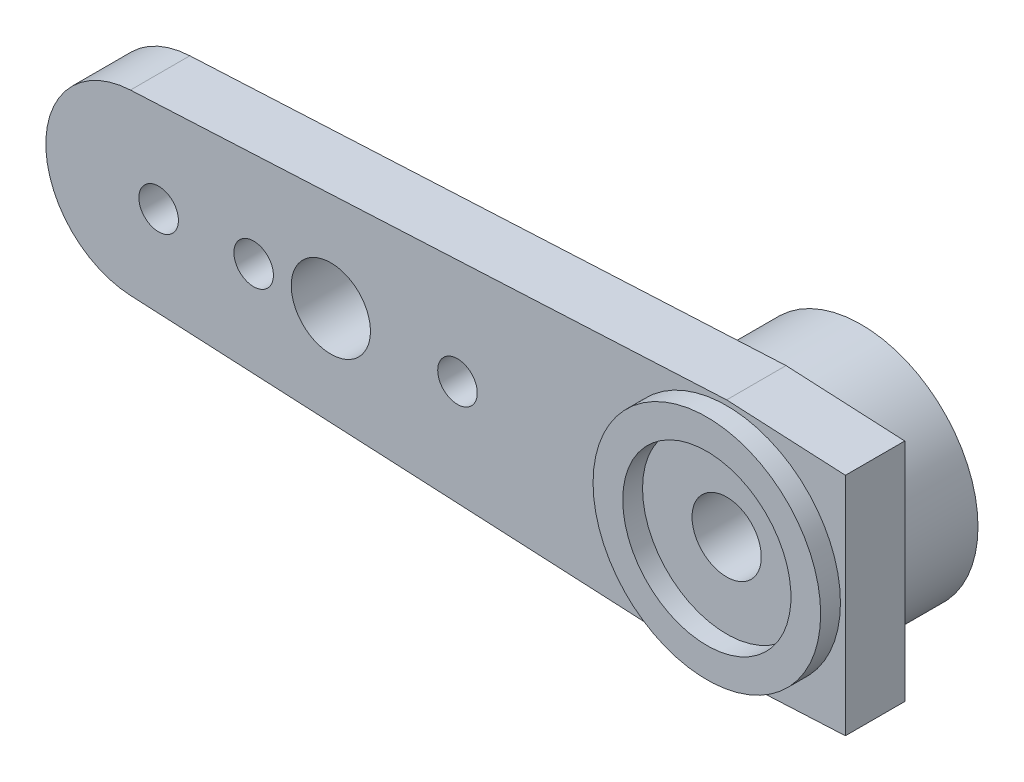
ISO-10303-21;
HEADER;
FILE_DESCRIPTION(('STEP AP214'),'2;1');
FILE_NAME('part.step','',(''),(''),'','','');
FILE_SCHEMA(('AUTOMOTIVE_DESIGN { 1 0 10303 214 1 1 1 1 }'));
ENDSEC;
DATA;
#1=APPLICATION_CONTEXT('core data for automotive mechanical design processes');
#2=APPLICATION_PROTOCOL_DEFINITION('international standard','automotive_design',2000,#1);
#3=PRODUCT_CONTEXT('',#1,'mechanical');
#4=PRODUCT('Part','Part','',(#3));
#5=PRODUCT_RELATED_PRODUCT_CATEGORY('part','',(#4));
#6=PRODUCT_DEFINITION_FORMATION('','',#4);
#7=PRODUCT_DEFINITION_CONTEXT('part definition',#1,'design');
#8=PRODUCT_DEFINITION('design','',#6,#7);
#9=PRODUCT_DEFINITION_SHAPE('','',#8);
#10=(LENGTH_UNIT() NAMED_UNIT(*) SI_UNIT(.MILLI.,.METRE.));
#11=(NAMED_UNIT(*) PLANE_ANGLE_UNIT() SI_UNIT($,.RADIAN.));
#12=(NAMED_UNIT(*) SI_UNIT($,.STERADIAN.) SOLID_ANGLE_UNIT());
#13=UNCERTAINTY_MEASURE_WITH_UNIT(LENGTH_MEASURE(1.E-05),#10,'distance_accuracy_value','');
#14=(GEOMETRIC_REPRESENTATION_CONTEXT(3) GLOBAL_UNCERTAINTY_ASSIGNED_CONTEXT((#13)) GLOBAL_UNIT_ASSIGNED_CONTEXT((#10,
#11,#12)) REPRESENTATION_CONTEXT('',''));
#15=CARTESIAN_POINT('',(0.,0.,0.));
#16=DIRECTION('',(0.,0.,1.));
#17=DIRECTION('',(1.,0.,0.));
#18=AXIS2_PLACEMENT_3D('',#15,#16,#17);
#19=CARTESIAN_POINT('',(-14.95,0.,3.4));
#20=DIRECTION('',(0.,0.,1.));
#21=DIRECTION('',(-1.,0.,0.));
#22=AXIS2_PLACEMENT_3D('',#19,#20,#21);
#23=PLANE('',#22);
#24=CARTESIAN_POINT('',(0.,0.,3.4));
#25=DIRECTION('',(0.,0.,-1.));
#26=DIRECTION('',(-1.,0.,0.));
#27=AXIS2_PLACEMENT_3D('',#24,#25,#26);
#28=CIRCLE('',#27,0.875);
#29=CARTESIAN_POINT('',(-0.875,0.,3.4));
#30=VERTEX_POINT('',#29);
#31=EDGE_CURVE('E154',#30,#30,#28,.T.);
#32=ORIENTED_EDGE('',*,*,#31,.T.);
#33=EDGE_LOOP('',(#32));
#34=FACE_BOUND('',#33,.T.);
#35=CARTESIAN_POINT('',(0.,0.,3.4));
#36=DIRECTION('',(0.,0.,-1.));
#37=DIRECTION('',(-1.,0.,0.));
#38=AXIS2_PLACEMENT_3D('',#35,#36,#37);
#39=CIRCLE('',#38,2.125);
#40=CARTESIAN_POINT('',(-2.125,0.,3.4));
#41=VERTEX_POINT('',#40);
#42=EDGE_CURVE('E47',#41,#41,#39,.F.);
#43=ORIENTED_EDGE('',*,*,#42,.T.);
#44=EDGE_LOOP('',(#43));
#45=FACE_BOUND('',#44,.T.);
#46=ADVANCED_FACE('F39',(#34,#45),#23,.T.);
#47=CARTESIAN_POINT('',(0.,0.,0.));
#48=DIRECTION('',(0.,0.,1.));
#49=DIRECTION('',(-1.,0.,0.));
#50=AXIS2_PLACEMENT_3D('',#47,#48,#49);
#51=PLANE('',#50);
#52=CARTESIAN_POINT('',(0.,0.,0.));
#53=DIRECTION('',(0.,0.,-1.));
#54=DIRECTION('',(-1.,0.,0.));
#55=AXIS2_PLACEMENT_3D('',#52,#53,#54);
#56=CIRCLE('',#55,2.95);
#57=CARTESIAN_POINT('',(2.95,0.,0.));
#58=VERTEX_POINT('',#57);
#59=EDGE_CURVE('E190',#58,#58,#56,.T.);
#60=ORIENTED_EDGE('',*,*,#59,.T.);
#61=EDGE_LOOP('',(#60));
#62=FACE_BOUND('',#61,.T.);
#63=CARTESIAN_POINT('',(0.,0.,0.));
#64=DIRECTION('',(0.,0.,-1.));
#65=DIRECTION('',(-1.,0.,0.));
#66=AXIS2_PLACEMENT_3D('',#63,#64,#65);
#67=CIRCLE('',#66,2.25);
#68=CARTESIAN_POINT('',(2.25,0.,0.));
#69=VERTEX_POINT('',#68);
#70=EDGE_CURVE('E187',#69,#69,#67,.T.);
#71=ORIENTED_EDGE('',*,*,#70,.F.);
#72=EDGE_LOOP('',(#71));
#73=FACE_BOUND('',#72,.T.);
#74=ADVANCED_FACE('F236',(#62,#73),#51,.F.);
#75=CARTESIAN_POINT('',(0.,0.,1.9));
#76=DIRECTION('',(0.,0.,-1.));
#77=DIRECTION('',(1.,0.,0.));
#78=AXIS2_PLACEMENT_3D('',#75,#76,#77);
#79=CYLINDRICAL_SURFACE('',#78,2.95);
#80=CARTESIAN_POINT('',(0.,0.,1.9));
#81=DIRECTION('',(0.,0.,-1.));
#82=DIRECTION('',(-1.,0.,0.));
#83=AXIS2_PLACEMENT_3D('',#80,#81,#82);
#84=CIRCLE('',#83,2.95);
#85=CARTESIAN_POINT('',(2.95,0.,1.9));
#86=VERTEX_POINT('',#85);
#87=EDGE_CURVE('E191',#86,#86,#84,.T.);
#88=CARTESIAN_POINT('',(2.95,0.,1.9));
#89=CARTESIAN_POINT('',(2.95,0.,1.88020833333333));
#90=CARTESIAN_POINT('',(2.95,0.,1.86041666666667));
#91=CARTESIAN_POINT('',(2.95,0.,1.82083333333333));
#92=CARTESIAN_POINT('',(2.95,0.,1.80104166666667));
#93=CARTESIAN_POINT('',(2.95,0.,1.76145833333333));
#94=CARTESIAN_POINT('',(2.95,0.,1.74166666666667));
#95=CARTESIAN_POINT('',(2.95,0.,1.70208333333333));
#96=CARTESIAN_POINT('',(2.95,0.,1.68229166666667));
#97=CARTESIAN_POINT('',(2.95,0.,1.64270833333333));
#98=CARTESIAN_POINT('',(2.95,0.,1.62291666666667));
#99=CARTESIAN_POINT('',(2.95,0.,1.58333333333333));
#100=CARTESIAN_POINT('',(2.95,0.,1.56354166666667));
#101=CARTESIAN_POINT('',(2.95,0.,1.52395833333333));
#102=CARTESIAN_POINT('',(2.95,0.,1.50416666666667));
#103=CARTESIAN_POINT('',(2.95,0.,1.46458333333333));
#104=CARTESIAN_POINT('',(2.95,0.,1.44479166666667));
#105=CARTESIAN_POINT('',(2.95,0.,1.40520833333333));
#106=CARTESIAN_POINT('',(2.95,0.,1.38541666666667));
#107=CARTESIAN_POINT('',(2.95,0.,1.34583333333333));
#108=CARTESIAN_POINT('',(2.95,0.,1.32604166666667));
#109=CARTESIAN_POINT('',(2.95,0.,1.28645833333333));
#110=CARTESIAN_POINT('',(2.95,0.,1.26666666666667));
#111=CARTESIAN_POINT('',(2.95,0.,1.22708333333333));
#112=CARTESIAN_POINT('',(2.95,0.,1.20729166666667));
#113=CARTESIAN_POINT('',(2.95,0.,1.16770833333333));
#114=CARTESIAN_POINT('',(2.95,0.,1.14791666666667));
#115=CARTESIAN_POINT('',(2.95,0.,1.10833333333333));
#116=CARTESIAN_POINT('',(2.95,0.,1.08854166666667));
#117=CARTESIAN_POINT('',(2.95,0.,1.04895833333333));
#118=CARTESIAN_POINT('',(2.95,0.,1.02916666666667));
#119=CARTESIAN_POINT('',(2.95,0.,0.989583333333333));
#120=CARTESIAN_POINT('',(2.95,0.,0.969791666666667));
#121=CARTESIAN_POINT('',(2.95,0.,0.930208333333333));
#122=CARTESIAN_POINT('',(2.95,0.,0.910416666666667));
#123=CARTESIAN_POINT('',(2.95,0.,0.870833333333333));
#124=CARTESIAN_POINT('',(2.95,0.,0.851041666666667));
#125=CARTESIAN_POINT('',(2.95,0.,0.811458333333333));
#126=CARTESIAN_POINT('',(2.95,0.,0.791666666666667));
#127=CARTESIAN_POINT('',(2.95,0.,0.752083333333333));
#128=CARTESIAN_POINT('',(2.95,0.,0.732291666666667));
#129=CARTESIAN_POINT('',(2.95,0.,0.692708333333333));
#130=CARTESIAN_POINT('',(2.95,0.,0.672916666666667));
#131=CARTESIAN_POINT('',(2.95,0.,0.633333333333333));
#132=CARTESIAN_POINT('',(2.95,0.,0.613541666666667));
#133=CARTESIAN_POINT('',(2.95,0.,0.573958333333333));
#134=CARTESIAN_POINT('',(2.95,0.,0.554166666666667));
#135=CARTESIAN_POINT('',(2.95,0.,0.514583333333334));
#136=CARTESIAN_POINT('',(2.95,0.,0.494791666666667));
#137=CARTESIAN_POINT('',(2.95,0.,0.455208333333333));
#138=CARTESIAN_POINT('',(2.95,0.,0.435416666666667));
#139=CARTESIAN_POINT('',(2.95,0.,0.395833333333333));
#140=CARTESIAN_POINT('',(2.95,0.,0.376041666666667));
#141=CARTESIAN_POINT('',(2.95,0.,0.336458333333333));
#142=CARTESIAN_POINT('',(2.95,0.,0.316666666666667));
#143=CARTESIAN_POINT('',(2.95,0.,0.277083333333333));
#144=CARTESIAN_POINT('',(2.95,0.,0.257291666666667));
#145=CARTESIAN_POINT('',(2.95,0.,0.217708333333333));
#146=CARTESIAN_POINT('',(2.95,0.,0.197916666666667));
#147=CARTESIAN_POINT('',(2.95,0.,0.158333333333333));
#148=CARTESIAN_POINT('',(2.95,0.,0.138541666666667));
#149=CARTESIAN_POINT('',(2.95,0.,0.0989583333333333));
#150=CARTESIAN_POINT('',(2.95,0.,0.0791666666666666));
#151=CARTESIAN_POINT('',(2.95,0.,0.0395833333333333));
#152=CARTESIAN_POINT('',(2.95,0.,0.0197916666666666));
#153=CARTESIAN_POINT('',(2.95,0.,0.));
#154=B_SPLINE_CURVE_WITH_KNOTS('',3,(#88,#89,#90,#91,#92,#93,#94,#95,#96,#97,#98,#99,#100,#101,
#102,#103,#104,#105,#106,#107,#108,#109,#110,#111,#112,#113,#114,#115,#116,#117,#118,#119,#120,
#121,#122,#123,#124,#125,#126,#127,#128,#129,#130,#131,#132,#133,#134,#135,#136,#137,#138,#139,
#140,#141,#142,#143,#144,#145,#146,#147,#148,#149,#150,#151,#152,#153),.UNSPECIFIED.,.F.,.F.,(4,
2,2,2,2,2,2,2,2,2,2,2,2,2,2,2,2,2,2,2,2,2,2,2,2,2,2,2,2,2,2,2,4),(0.,0.059375,0.11875,0.178125,
0.2375,0.296875,0.35625,0.415625,0.475,0.534375,0.59375,0.653125,0.7125,0.771875,0.83125,
0.890625,0.95,1.009375,1.06875,1.128125,1.1875,1.246875,1.30625,1.365625,1.425,1.484375,1.54375,
1.603125,1.6625,1.721875,1.78125,1.840625,1.9),.UNSPECIFIED.);
#155=EDGE_CURVE('BSEAM41',#86,#58,#154,.T.);
#156=ORIENTED_EDGE('',*,*,#87,.T.);
#157=ORIENTED_EDGE('',*,*,#59,.F.);
#158=ORIENTED_EDGE('',*,*,#155,.T.);
#159=ORIENTED_EDGE('',*,*,#155,.F.);
#160=EDGE_LOOP('',(#156,#158,#157,#159));
#161=FACE_BOUND('',#160,.T.);
#162=ADVANCED_FACE('F41',(#161),#79,.T.);
#163=CARTESIAN_POINT('',(0.,0.,1.9));
#164=DIRECTION('',(0.,0.,-1.));
#165=DIRECTION('',(1.,0.,0.));
#166=AXIS2_PLACEMENT_3D('',#163,#164,#165);
#167=CYLINDRICAL_SURFACE('',#166,2.25);
#168=CARTESIAN_POINT('',(0.,0.,1.9));
#169=DIRECTION('',(0.,0.,-1.));
#170=DIRECTION('',(-1.,0.,0.));
#171=AXIS2_PLACEMENT_3D('',#168,#169,#170);
#172=CIRCLE('',#171,2.25);
#173=CARTESIAN_POINT('',(2.25,0.,1.9));
#174=VERTEX_POINT('',#173);
#175=EDGE_CURVE('E184',#174,#174,#172,.T.);
#176=CARTESIAN_POINT('',(2.25,0.,1.9));
#177=CARTESIAN_POINT('',(2.25,0.,1.88020833333333));
#178=CARTESIAN_POINT('',(2.25,0.,1.86041666666667));
#179=CARTESIAN_POINT('',(2.25,0.,1.82083333333333));
#180=CARTESIAN_POINT('',(2.25,0.,1.80104166666667));
#181=CARTESIAN_POINT('',(2.25,0.,1.76145833333333));
#182=CARTESIAN_POINT('',(2.25,0.,1.74166666666667));
#183=CARTESIAN_POINT('',(2.25,0.,1.70208333333333));
#184=CARTESIAN_POINT('',(2.25,0.,1.68229166666667));
#185=CARTESIAN_POINT('',(2.25,0.,1.64270833333333));
#186=CARTESIAN_POINT('',(2.25,0.,1.62291666666667));
#187=CARTESIAN_POINT('',(2.25,0.,1.58333333333333));
#188=CARTESIAN_POINT('',(2.25,0.,1.56354166666667));
#189=CARTESIAN_POINT('',(2.25,0.,1.52395833333333));
#190=CARTESIAN_POINT('',(2.25,0.,1.50416666666667));
#191=CARTESIAN_POINT('',(2.25,0.,1.46458333333333));
#192=CARTESIAN_POINT('',(2.25,0.,1.44479166666667));
#193=CARTESIAN_POINT('',(2.25,0.,1.40520833333333));
#194=CARTESIAN_POINT('',(2.25,0.,1.38541666666667));
#195=CARTESIAN_POINT('',(2.25,0.,1.34583333333333));
#196=CARTESIAN_POINT('',(2.25,0.,1.32604166666667));
#197=CARTESIAN_POINT('',(2.25,0.,1.28645833333333));
#198=CARTESIAN_POINT('',(2.25,0.,1.26666666666667));
#199=CARTESIAN_POINT('',(2.25,0.,1.22708333333333));
#200=CARTESIAN_POINT('',(2.25,0.,1.20729166666667));
#201=CARTESIAN_POINT('',(2.25,0.,1.16770833333333));
#202=CARTESIAN_POINT('',(2.25,0.,1.14791666666667));
#203=CARTESIAN_POINT('',(2.25,0.,1.10833333333333));
#204=CARTESIAN_POINT('',(2.25,0.,1.08854166666667));
#205=CARTESIAN_POINT('',(2.25,0.,1.04895833333333));
#206=CARTESIAN_POINT('',(2.25,0.,1.02916666666667));
#207=CARTESIAN_POINT('',(2.25,0.,0.989583333333333));
#208=CARTESIAN_POINT('',(2.25,0.,0.969791666666667));
#209=CARTESIAN_POINT('',(2.25,0.,0.930208333333333));
#210=CARTESIAN_POINT('',(2.25,0.,0.910416666666667));
#211=CARTESIAN_POINT('',(2.25,0.,0.870833333333333));
#212=CARTESIAN_POINT('',(2.25,0.,0.851041666666667));
#213=CARTESIAN_POINT('',(2.25,0.,0.811458333333333));
#214=CARTESIAN_POINT('',(2.25,0.,0.791666666666667));
#215=CARTESIAN_POINT('',(2.25,0.,0.752083333333333));
#216=CARTESIAN_POINT('',(2.25,0.,0.732291666666667));
#217=CARTESIAN_POINT('',(2.25,0.,0.692708333333333));
#218=CARTESIAN_POINT('',(2.25,0.,0.672916666666667));
#219=CARTESIAN_POINT('',(2.25,0.,0.633333333333333));
#220=CARTESIAN_POINT('',(2.25,0.,0.613541666666667));
#221=CARTESIAN_POINT('',(2.25,0.,0.573958333333333));
#222=CARTESIAN_POINT('',(2.25,0.,0.554166666666667));
#223=CARTESIAN_POINT('',(2.25,0.,0.514583333333334));
#224=CARTESIAN_POINT('',(2.25,0.,0.494791666666667));
#225=CARTESIAN_POINT('',(2.25,0.,0.455208333333333));
#226=CARTESIAN_POINT('',(2.25,0.,0.435416666666667));
#227=CARTESIAN_POINT('',(2.25,0.,0.395833333333333));
#228=CARTESIAN_POINT('',(2.25,0.,0.376041666666667));
#229=CARTESIAN_POINT('',(2.25,0.,0.336458333333333));
#230=CARTESIAN_POINT('',(2.25,0.,0.316666666666667));
#231=CARTESIAN_POINT('',(2.25,0.,0.277083333333333));
#232=CARTESIAN_POINT('',(2.25,0.,0.257291666666667));
#233=CARTESIAN_POINT('',(2.25,0.,0.217708333333333));
#234=CARTESIAN_POINT('',(2.25,0.,0.197916666666667));
#235=CARTESIAN_POINT('',(2.25,0.,0.158333333333333));
#236=CARTESIAN_POINT('',(2.25,0.,0.138541666666667));
#237=CARTESIAN_POINT('',(2.25,0.,0.0989583333333333));
#238=CARTESIAN_POINT('',(2.25,0.,0.0791666666666666));
#239=CARTESIAN_POINT('',(2.25,0.,0.0395833333333333));
#240=CARTESIAN_POINT('',(2.25,0.,0.0197916666666666));
#241=CARTESIAN_POINT('',(2.25,0.,0.));
#242=B_SPLINE_CURVE_WITH_KNOTS('',3,(#176,#177,#178,#179,#180,#181,#182,#183,#184,#185,#186,
#187,#188,#189,#190,#191,#192,#193,#194,#195,#196,#197,#198,#199,#200,#201,#202,#203,#204,#205,
#206,#207,#208,#209,#210,#211,#212,#213,#214,#215,#216,#217,#218,#219,#220,#221,#222,#223,#224,
#225,#226,#227,#228,#229,#230,#231,#232,#233,#234,#235,#236,#237,#238,#239,#240,#241),
.UNSPECIFIED.,.F.,.F.,(4,2,2,2,2,2,2,2,2,2,2,2,2,2,2,2,2,2,2,2,2,2,2,2,2,2,2,2,2,2,2,2,4),(0.,
0.059375,0.11875,0.178125,0.2375,0.296875,0.35625,0.415625,0.475,0.534375,0.59375,0.653125,
0.7125,0.771875,0.83125,0.890625,0.95,1.009375,1.06875,1.128125,1.1875,1.246875,1.30625,
1.365625,1.425,1.484375,1.54375,1.603125,1.6625,1.721875,1.78125,1.840625,1.9),.UNSPECIFIED.);
#243=EDGE_CURVE('BSEAM249',#174,#69,#242,.T.);
#244=ORIENTED_EDGE('',*,*,#175,.F.);
#245=ORIENTED_EDGE('',*,*,#70,.T.);
#246=ORIENTED_EDGE('',*,*,#243,.T.);
#247=ORIENTED_EDGE('',*,*,#243,.F.);
#248=EDGE_LOOP('',(#244,#246,#245,#247));
#249=FACE_BOUND('',#248,.T.);
#250=ADVANCED_FACE('F249',(#249),#167,.F.);
#251=CARTESIAN_POINT('',(-14.95,0.,1.9));
#252=DIRECTION('',(0.,0.,1.));
#253=DIRECTION('',(-1.,0.,0.));
#254=AXIS2_PLACEMENT_3D('',#251,#252,#253);
#255=PLANE('',#254);
#256=CARTESIAN_POINT('',(0.,0.,1.9));
#257=DIRECTION('',(0.,0.,-1.));
#258=DIRECTION('',(-1.,0.,0.));
#259=AXIS2_PLACEMENT_3D('',#256,#257,#258);
#260=CIRCLE('',#259,0.875);
#261=CARTESIAN_POINT('',(-0.875,0.,1.9));
#262=VERTEX_POINT('',#261);
#263=EDGE_CURVE('E151',#262,#262,#260,.T.);
#264=ORIENTED_EDGE('',*,*,#263,.F.);
#265=EDGE_LOOP('',(#264));
#266=FACE_BOUND('',#265,.T.);
#267=ORIENTED_EDGE('',*,*,#175,.T.);
#268=EDGE_LOOP('',(#267));
#269=FACE_BOUND('',#268,.T.);
#270=ADVANCED_FACE('F207',(#266,#269),#255,.F.);
#271=DIRECTION('',(0.,1.,0.));
#272=VECTOR('',#271,1.);
#273=CARTESIAN_POINT('',(3.,2.85006189166887,3.4));
#274=LINE('',#273,#272);
#275=CARTESIAN_POINT('',(3.,-2.85006189166887,3.4));
#276=VERTEX_POINT('',#275);
#277=CARTESIAN_POINT('',(3.,2.85006189166887,3.4));
#278=VERTEX_POINT('',#277);
#279=EDGE_CURVE('E109',#276,#278,#274,.T.);
#280=ORIENTED_EDGE('',*,*,#279,.T.);
#281=DIRECTION('',(0.998753366339054,-0.0499170634794085,0.));
#282=VECTOR('',#281,1.);
#283=CARTESIAN_POINT('',(15.0623133928287,2.24719507426287,3.4));
#284=LINE('',#283,#282);
#285=CARTESIAN_POINT('',(0.,3.,3.4));
#286=VERTEX_POINT('',#285);
#287=EDGE_CURVE('E112',#286,#278,#284,.T.);
#288=ORIENTED_EDGE('',*,*,#287,.F.);
#289=DIRECTION('',(0.998753366339054,0.0499170634794085,0.));
#290=VECTOR('',#289,1.);
#291=CARTESIAN_POINT('',(-15.0623133928287,2.24719507426287,3.4));
#292=LINE('',#291,#290);
#293=CARTESIAN_POINT('',(-15.0623133928287,2.24719507426287,3.4));
#294=VERTEX_POINT('',#293);
#295=EDGE_CURVE('E162',#294,#286,#292,.T.);
#296=ORIENTED_EDGE('',*,*,#295,.F.);
#297=CARTESIAN_POINT('',(-14.95,0.,3.4));
#298=DIRECTION('',(0.,0.,-1.));
#299=DIRECTION('',(-1.,0.,0.));
#300=AXIS2_PLACEMENT_3D('',#297,#298,#299);
#301=CIRCLE('',#300,2.25);
#302=CARTESIAN_POINT('',(-15.0623133928287,-2.24719507426287,3.4));
#303=VERTEX_POINT('',#302);
#304=EDGE_CURVE('E160',#303,#294,#301,.T.);
#305=ORIENTED_EDGE('',*,*,#304,.F.);
#306=DIRECTION('',(-0.998753366339054,0.0499170634794085,0.));
#307=VECTOR('',#306,1.);
#308=CARTESIAN_POINT('',(-15.0623133928287,-2.24719507426287,3.4));
#309=LINE('',#308,#307);
#310=CARTESIAN_POINT('',(0.,-3.,3.4));
#311=VERTEX_POINT('',#310);
#312=EDGE_CURVE('E111',#311,#303,#309,.T.);
#313=ORIENTED_EDGE('',*,*,#312,.F.);
#314=DIRECTION('',(-0.998753366339054,-0.0499170634794085,0.));
#315=VECTOR('',#314,1.);
#316=CARTESIAN_POINT('',(15.0623133928287,-2.24719507426287,3.4));
#317=LINE('',#316,#315);
#318=EDGE_CURVE('E100',#276,#311,#317,.T.);
#319=ORIENTED_EDGE('',*,*,#318,.F.);
#320=EDGE_LOOP('',(#280,#288,#296,#305,#313,#319));
#321=FACE_BOUND('',#320,.T.);
#322=CARTESIAN_POINT('',(-10.,0.,3.4));
#323=DIRECTION('',(0.,0.,-1.));
#324=DIRECTION('',(-1.,0.,0.));
#325=AXIS2_PLACEMENT_3D('',#322,#323,#324);
#326=CIRCLE('',#325,1.);
#327=CARTESIAN_POINT('',(-11.,0.,3.4));
#328=VERTEX_POINT('',#327);
#329=EDGE_CURVE('E122',#328,#328,#326,.T.);
#330=ORIENTED_EDGE('',*,*,#329,.T.);
#331=EDGE_LOOP('',(#330));
#332=FACE_BOUND('',#331,.T.);
#333=CARTESIAN_POINT('',(0.,0.,3.4));
#334=DIRECTION('',(0.,0.,-1.));
#335=DIRECTION('',(-1.,0.,0.));
#336=AXIS2_PLACEMENT_3D('',#333,#334,#335);
#337=CIRCLE('',#336,2.875);
#338=CARTESIAN_POINT('',(-2.875,0.,3.4));
#339=VERTEX_POINT('',#338);
#340=EDGE_CURVE('E129',#339,#339,#337,.T.);
#341=ORIENTED_EDGE('',*,*,#340,.T.);
#342=EDGE_LOOP('',(#341));
#343=FACE_BOUND('',#342,.T.);
#344=CARTESIAN_POINT('',(-11.95,0.,3.4));
#345=DIRECTION('',(0.,0.,-1.));
#346=DIRECTION('',(-1.,0.,0.));
#347=AXIS2_PLACEMENT_3D('',#344,#345,#346);
#348=CIRCLE('',#347,0.500000000000001);
#349=CARTESIAN_POINT('',(-12.45,0.,3.4));
#350=VERTEX_POINT('',#349);
#351=EDGE_CURVE('E142',#350,#350,#348,.T.);
#352=ORIENTED_EDGE('',*,*,#351,.T.);
#353=EDGE_LOOP('',(#352));
#354=FACE_BOUND('',#353,.T.);
#355=CARTESIAN_POINT('',(-6.8,0.,3.4));
#356=DIRECTION('',(0.,0.,-1.));
#357=DIRECTION('',(-1.,0.,0.));
#358=AXIS2_PLACEMENT_3D('',#355,#356,#357);
#359=CIRCLE('',#358,0.500000000000001);
#360=CARTESIAN_POINT('',(-7.3,0.,3.4));
#361=VERTEX_POINT('',#360);
#362=EDGE_CURVE('E148',#361,#361,#359,.T.);
#363=ORIENTED_EDGE('',*,*,#362,.T.);
#364=EDGE_LOOP('',(#363));
#365=FACE_BOUND('',#364,.T.);
#366=CARTESIAN_POINT('',(-14.35,0.,3.4));
#367=DIRECTION('',(0.,0.,-1.));
#368=DIRECTION('',(-1.,0.,0.));
#369=AXIS2_PLACEMENT_3D('',#366,#367,#368);
#370=CIRCLE('',#369,0.500000000000001);
#371=CARTESIAN_POINT('',(-14.85,0.,3.4));
#372=VERTEX_POINT('',#371);
#373=EDGE_CURVE('E136',#372,#372,#370,.T.);
#374=ORIENTED_EDGE('',*,*,#373,.T.);
#375=EDGE_LOOP('',(#374));
#376=FACE_BOUND('',#375,.T.);
#377=ADVANCED_FACE('F106',(#321,#332,#343,#354,#365,#376),#23,.T.);
#378=CARTESIAN_POINT('',(-10.,0.,1.9));
#379=DIRECTION('',(0.,0.,-1.));
#380=DIRECTION('',(-1.,0.,0.));
#381=AXIS2_PLACEMENT_3D('',#378,#379,#380);
#382=CIRCLE('',#381,1.);
#383=CARTESIAN_POINT('',(-11.,0.,1.9));
#384=VERTEX_POINT('',#383);
#385=EDGE_CURVE('E125',#384,#384,#382,.T.);
#386=ORIENTED_EDGE('',*,*,#385,.F.);
#387=EDGE_LOOP('',(#386));
#388=FACE_BOUND('',#387,.T.);
#389=ORIENTED_EDGE('',*,*,#87,.F.);
#390=EDGE_LOOP('',(#389));
#391=FACE_BOUND('',#390,.T.);
#392=DIRECTION('',(-0.998753366339054,-0.0499170634794085,0.));
#393=VECTOR('',#392,1.);
#394=CARTESIAN_POINT('',(15.0623133928287,-2.24719507426287,1.9));
#395=LINE('',#394,#393);
#396=CARTESIAN_POINT('',(3.,-2.85006189166887,1.9));
#397=VERTEX_POINT('',#396);
#398=CARTESIAN_POINT('',(0.,-3.,1.9));
#399=VERTEX_POINT('',#398);
#400=EDGE_CURVE('E103',#397,#399,#395,.T.);
#401=ORIENTED_EDGE('',*,*,#400,.T.);
#402=DIRECTION('',(-0.998753366339054,0.0499170634794085,0.));
#403=VECTOR('',#402,1.);
#404=CARTESIAN_POINT('',(-15.0623133928287,-2.24719507426287,1.9));
#405=LINE('',#404,#403);
#406=CARTESIAN_POINT('',(-15.0623133928287,-2.24719507426287,1.9));
#407=VERTEX_POINT('',#406);
#408=EDGE_CURVE('E163',#399,#407,#405,.T.);
#409=ORIENTED_EDGE('',*,*,#408,.T.);
#410=CARTESIAN_POINT('',(-14.95,0.,1.9));
#411=DIRECTION('',(0.,0.,-1.));
#412=DIRECTION('',(-1.,0.,0.));
#413=AXIS2_PLACEMENT_3D('',#410,#411,#412);
#414=CIRCLE('',#413,2.25);
#415=CARTESIAN_POINT('',(-15.0623133928287,2.24719507426287,1.9));
#416=VERTEX_POINT('',#415);
#417=EDGE_CURVE('E157',#407,#416,#414,.T.);
#418=ORIENTED_EDGE('',*,*,#417,.T.);
#419=DIRECTION('',(0.998753366339054,0.0499170634794085,0.));
#420=VECTOR('',#419,1.);
#421=CARTESIAN_POINT('',(-15.0623133928287,2.24719507426287,1.9));
#422=LINE('',#421,#420);
#423=CARTESIAN_POINT('',(0.,3.,1.9));
#424=VERTEX_POINT('',#423);
#425=EDGE_CURVE('E169',#416,#424,#422,.T.);
#426=ORIENTED_EDGE('',*,*,#425,.T.);
#427=DIRECTION('',(0.998753366339054,-0.0499170634794085,0.));
#428=VECTOR('',#427,1.);
#429=CARTESIAN_POINT('',(15.0623133928287,2.24719507426287,1.9));
#430=LINE('',#429,#428);
#431=CARTESIAN_POINT('',(3.,2.85006189166887,1.9));
#432=VERTEX_POINT('',#431);
#433=EDGE_CURVE('E172',#424,#432,#430,.T.);
#434=ORIENTED_EDGE('',*,*,#433,.T.);
#435=DIRECTION('',(0.,1.,0.));
#436=VECTOR('',#435,1.);
#437=CARTESIAN_POINT('',(3.,0.,1.9));
#438=LINE('',#437,#436);
#439=EDGE_CURVE('E118',#397,#432,#438,.T.);
#440=ORIENTED_EDGE('',*,*,#439,.F.);
#441=EDGE_LOOP('',(#401,#409,#418,#426,#434,#440));
#442=FACE_BOUND('',#441,.T.);
#443=CARTESIAN_POINT('',(-6.8,0.,1.9));
#444=DIRECTION('',(0.,0.,-1.));
#445=DIRECTION('',(-1.,0.,0.));
#446=AXIS2_PLACEMENT_3D('',#443,#444,#445);
#447=CIRCLE('',#446,0.500000000000001);
#448=CARTESIAN_POINT('',(-7.3,0.,1.9));
#449=VERTEX_POINT('',#448);
#450=EDGE_CURVE('E145',#449,#449,#447,.T.);
#451=ORIENTED_EDGE('',*,*,#450,.F.);
#452=EDGE_LOOP('',(#451));
#453=FACE_BOUND('',#452,.T.);
#454=CARTESIAN_POINT('',(-11.95,0.,1.9));
#455=DIRECTION('',(0.,0.,-1.));
#456=DIRECTION('',(-1.,0.,0.));
#457=AXIS2_PLACEMENT_3D('',#454,#455,#456);
#458=CIRCLE('',#457,0.500000000000001);
#459=CARTESIAN_POINT('',(-12.45,0.,1.9));
#460=VERTEX_POINT('',#459);
#461=EDGE_CURVE('E139',#460,#460,#458,.T.);
#462=ORIENTED_EDGE('',*,*,#461,.F.);
#463=EDGE_LOOP('',(#462));
#464=FACE_BOUND('',#463,.T.);
#465=CARTESIAN_POINT('',(-14.35,0.,1.9));
#466=DIRECTION('',(0.,0.,-1.));
#467=DIRECTION('',(-1.,0.,0.));
#468=AXIS2_PLACEMENT_3D('',#465,#466,#467);
#469=CIRCLE('',#468,0.500000000000001);
#470=CARTESIAN_POINT('',(-14.85,0.,1.9));
#471=VERTEX_POINT('',#470);
#472=EDGE_CURVE('E133',#471,#471,#469,.T.);
#473=ORIENTED_EDGE('',*,*,#472,.F.);
#474=EDGE_LOOP('',(#473));
#475=FACE_BOUND('',#474,.T.);
#476=ADVANCED_FACE('F202',(#388,#391,#442,#453,#464,#475),#255,.F.);
#477=CARTESIAN_POINT('',(-14.95,0.,3.4));
#478=DIRECTION('',(0.,0.,-1.));
#479=DIRECTION('',(1.,0.,0.));
#480=AXIS2_PLACEMENT_3D('',#477,#478,#479);
#481=CYLINDRICAL_SURFACE('',#480,2.25);
#482=ORIENTED_EDGE('',*,*,#417,.F.);
#483=DIRECTION('',(0.,0.,-1.));
#484=VECTOR('',#483,1.);
#485=CARTESIAN_POINT('',(-15.0623133928287,-2.24719507426287,3.4));
#486=LINE('',#485,#484);
#487=EDGE_CURVE('E61',#303,#407,#486,.T.);
#488=ORIENTED_EDGE('',*,*,#487,.F.);
#489=ORIENTED_EDGE('',*,*,#304,.T.);
#490=DIRECTION('',(0.,0.,-1.));
#491=VECTOR('',#490,1.);
#492=CARTESIAN_POINT('',(-15.0623133928287,2.24719507426287,3.4));
#493=LINE('',#492,#491);
#494=EDGE_CURVE('E86',#294,#416,#493,.T.);
#495=ORIENTED_EDGE('',*,*,#494,.T.);
#496=EDGE_LOOP('',(#482,#488,#489,#495));
#497=FACE_BOUND('',#496,.T.);
#498=ADVANCED_FACE('F205',(#497),#481,.T.);
#499=CARTESIAN_POINT('',(-15.0623133928287,2.24719507426287,3.4));
#500=DIRECTION('',(0.0499170634794085,-0.998753366339054,0.));
#501=DIRECTION('',(-0.998753366339054,-0.0499170634794085,0.));
#502=AXIS2_PLACEMENT_3D('',#499,#500,#501);
#503=PLANE('',#502);
#504=ORIENTED_EDGE('',*,*,#425,.F.);
#505=ORIENTED_EDGE('',*,*,#494,.F.);
#506=ORIENTED_EDGE('',*,*,#295,.T.);
#507=DIRECTION('',(0.,0.,-1.));
#508=VECTOR('',#507,1.);
#509=CARTESIAN_POINT('',(0.,3.,3.4));
#510=LINE('',#509,#508);
#511=EDGE_CURVE('E181',#286,#424,#510,.T.);
#512=ORIENTED_EDGE('',*,*,#511,.T.);
#513=EDGE_LOOP('',(#504,#505,#506,#512));
#514=FACE_BOUND('',#513,.T.);
#515=ADVANCED_FACE('F268',(#514),#503,.F.);
#516=CARTESIAN_POINT('',(15.0623133928287,2.24719507426287,3.4));
#517=DIRECTION('',(-0.0499170634794085,-0.998753366339054,0.));
#518=DIRECTION('',(-0.998753366339054,0.0499170634794085,0.));
#519=AXIS2_PLACEMENT_3D('',#516,#517,#518);
#520=PLANE('',#519);
#521=ORIENTED_EDGE('',*,*,#433,.F.);
#522=ORIENTED_EDGE('',*,*,#511,.F.);
#523=ORIENTED_EDGE('',*,*,#287,.T.);
#524=DIRECTION('',(0.,0.,1.));
#525=VECTOR('',#524,1.);
#526=CARTESIAN_POINT('',(3.,2.85006189166887,0.));
#527=LINE('',#526,#525);
#528=EDGE_CURVE('E115',#432,#278,#527,.T.);
#529=ORIENTED_EDGE('',*,*,#528,.F.);
#530=EDGE_LOOP('',(#521,#522,#523,#529));
#531=FACE_BOUND('',#530,.T.);
#532=ADVANCED_FACE('F265',(#531),#520,.F.);
#533=CARTESIAN_POINT('',(15.0623133928287,-2.24719507426287,3.4));
#534=DIRECTION('',(-0.0499170634794085,0.998753366339054,0.));
#535=DIRECTION('',(0.998753366339054,0.0499170634794085,0.));
#536=AXIS2_PLACEMENT_3D('',#533,#534,#535);
#537=PLANE('',#536);
#538=ORIENTED_EDGE('',*,*,#318,.T.);
#539=DIRECTION('',(0.,0.,-1.));
#540=VECTOR('',#539,1.);
#541=CARTESIAN_POINT('',(0.,-3.,3.4));
#542=LINE('',#541,#540);
#543=EDGE_CURVE('E179',#311,#399,#542,.T.);
#544=ORIENTED_EDGE('',*,*,#543,.T.);
#545=ORIENTED_EDGE('',*,*,#400,.F.);
#546=DIRECTION('',(0.,0.,-1.));
#547=VECTOR('',#546,1.);
#548=CARTESIAN_POINT('',(3.,-2.85006189166887,3.4));
#549=LINE('',#548,#547);
#550=EDGE_CURVE('E11',#276,#397,#549,.T.);
#551=ORIENTED_EDGE('',*,*,#550,.F.);
#552=EDGE_LOOP('',(#538,#544,#545,#551));
#553=FACE_BOUND('',#552,.T.);
#554=ADVANCED_FACE('F99',(#553),#537,.F.);
#555=CARTESIAN_POINT('',(-15.0623133928287,-2.24719507426287,3.4));
#556=DIRECTION('',(0.0499170634794085,0.998753366339054,0.));
#557=DIRECTION('',(0.998753366339054,-0.0499170634794085,0.));
#558=AXIS2_PLACEMENT_3D('',#555,#556,#557);
#559=PLANE('',#558);
#560=ORIENTED_EDGE('',*,*,#408,.F.);
#561=ORIENTED_EDGE('',*,*,#543,.F.);
#562=ORIENTED_EDGE('',*,*,#312,.T.);
#563=ORIENTED_EDGE('',*,*,#487,.T.);
#564=EDGE_LOOP('',(#560,#561,#562,#563));
#565=FACE_BOUND('',#564,.T.);
#566=ADVANCED_FACE('F259',(#565),#559,.F.);
#567=CARTESIAN_POINT('',(0.,0.,3.4));
#568=DIRECTION('',(0.,0.,-1.));
#569=DIRECTION('',(1.,0.,0.));
#570=AXIS2_PLACEMENT_3D('',#567,#568,#569);
#571=CYLINDRICAL_SURFACE('',#570,0.875);
#572=ORIENTED_EDGE('',*,*,#31,.F.);
#573=EDGE_LOOP('',(#572));
#574=FACE_BOUND('',#573,.T.);
#575=ORIENTED_EDGE('',*,*,#263,.T.);
#576=EDGE_LOOP('',(#575));
#577=FACE_BOUND('',#576,.T.);
#578=ADVANCED_FACE('F262',(#574,#577),#571,.F.);
#579=CARTESIAN_POINT('',(-6.8,0.,3.4));
#580=DIRECTION('',(0.,0.,-1.));
#581=DIRECTION('',(1.,0.,0.));
#582=AXIS2_PLACEMENT_3D('',#579,#580,#581);
#583=CYLINDRICAL_SURFACE('',#582,0.500000000000001);
#584=ORIENTED_EDGE('',*,*,#362,.F.);
#585=EDGE_LOOP('',(#584));
#586=FACE_BOUND('',#585,.T.);
#587=ORIENTED_EDGE('',*,*,#450,.T.);
#588=EDGE_LOOP('',(#587));
#589=FACE_BOUND('',#588,.T.);
#590=ADVANCED_FACE('F230',(#586,#589),#583,.F.);
#591=CARTESIAN_POINT('',(-11.95,0.,3.4));
#592=DIRECTION('',(0.,0.,-1.));
#593=DIRECTION('',(1.,0.,0.));
#594=AXIS2_PLACEMENT_3D('',#591,#592,#593);
#595=CYLINDRICAL_SURFACE('',#594,0.500000000000001);
#596=ORIENTED_EDGE('',*,*,#351,.F.);
#597=EDGE_LOOP('',(#596));
#598=FACE_BOUND('',#597,.T.);
#599=ORIENTED_EDGE('',*,*,#461,.T.);
#600=EDGE_LOOP('',(#599));
#601=FACE_BOUND('',#600,.T.);
#602=ADVANCED_FACE('F220',(#598,#601),#595,.F.);
#603=CARTESIAN_POINT('',(-14.35,0.,3.4));
#604=DIRECTION('',(0.,0.,-1.));
#605=DIRECTION('',(1.,0.,0.));
#606=AXIS2_PLACEMENT_3D('',#603,#604,#605);
#607=CYLINDRICAL_SURFACE('',#606,0.500000000000001);
#608=ORIENTED_EDGE('',*,*,#373,.F.);
#609=EDGE_LOOP('',(#608));
#610=FACE_BOUND('',#609,.T.);
#611=ORIENTED_EDGE('',*,*,#472,.T.);
#612=EDGE_LOOP('',(#611));
#613=FACE_BOUND('',#612,.T.);
#614=ADVANCED_FACE('F217',(#610,#613),#607,.F.);
#615=CARTESIAN_POINT('',(0.,0.,3.9));
#616=DIRECTION('',(0.,0.,1.));
#617=DIRECTION('',(-1.,0.,0.));
#618=AXIS2_PLACEMENT_3D('',#615,#616,#617);
#619=PLANE('',#618);
#620=CARTESIAN_POINT('',(0.,0.,3.9));
#621=DIRECTION('',(0.,0.,-1.));
#622=DIRECTION('',(-1.,0.,0.));
#623=AXIS2_PLACEMENT_3D('',#620,#621,#622);
#624=CIRCLE('',#623,2.875);
#625=CARTESIAN_POINT('',(-2.875,0.,3.9));
#626=VERTEX_POINT('',#625);
#627=EDGE_CURVE('E130',#626,#626,#624,.T.);
#628=ORIENTED_EDGE('',*,*,#627,.F.);
#629=EDGE_LOOP('',(#628));
#630=FACE_BOUND('',#629,.T.);
#631=CARTESIAN_POINT('',(0.,0.,3.9));
#632=DIRECTION('',(0.,0.,-1.));
#633=DIRECTION('',(-1.,0.,0.));
#634=AXIS2_PLACEMENT_3D('',#631,#632,#633);
#635=CIRCLE('',#634,2.125);
#636=CARTESIAN_POINT('',(-2.125,0.,3.9));
#637=VERTEX_POINT('',#636);
#638=EDGE_CURVE('E126',#637,#637,#635,.T.);
#639=ORIENTED_EDGE('',*,*,#638,.T.);
#640=EDGE_LOOP('',(#639));
#641=FACE_BOUND('',#640,.T.);
#642=ADVANCED_FACE('F219',(#630,#641),#619,.T.);
#643=CARTESIAN_POINT('',(0.,0.,3.9));
#644=DIRECTION('',(0.,0.,-1.));
#645=DIRECTION('',(1.,0.,0.));
#646=AXIS2_PLACEMENT_3D('',#643,#644,#645);
#647=CYLINDRICAL_SURFACE('',#646,2.875);
#648=ORIENTED_EDGE('',*,*,#627,.T.);
#649=EDGE_LOOP('',(#648));
#650=FACE_BOUND('',#649,.T.);
#651=ORIENTED_EDGE('',*,*,#340,.F.);
#652=EDGE_LOOP('',(#651));
#653=FACE_BOUND('',#652,.T.);
#654=ADVANCED_FACE('F227',(#650,#653),#647,.T.);
#655=CARTESIAN_POINT('',(0.,0.,3.9));
#656=DIRECTION('',(0.,0.,-1.));
#657=DIRECTION('',(1.,0.,0.));
#658=AXIS2_PLACEMENT_3D('',#655,#656,#657);
#659=CYLINDRICAL_SURFACE('',#658,2.125);
#660=ORIENTED_EDGE('',*,*,#638,.F.);
#661=EDGE_LOOP('',(#660));
#662=FACE_BOUND('',#661,.T.);
#663=ORIENTED_EDGE('',*,*,#42,.F.);
#664=EDGE_LOOP('',(#663));
#665=FACE_BOUND('',#664,.T.);
#666=ADVANCED_FACE('F331',(#662,#665),#659,.F.);
#667=CARTESIAN_POINT('',(-10.,0.,0.));
#668=DIRECTION('',(0.,0.,1.));
#669=DIRECTION('',(-1.,0.,0.));
#670=AXIS2_PLACEMENT_3D('',#667,#668,#669);
#671=CYLINDRICAL_SURFACE('',#670,1.);
#672=ORIENTED_EDGE('',*,*,#329,.F.);
#673=EDGE_LOOP('',(#672));
#674=FACE_BOUND('',#673,.T.);
#675=ORIENTED_EDGE('',*,*,#385,.T.);
#676=EDGE_LOOP('',(#675));
#677=FACE_BOUND('',#676,.T.);
#678=ADVANCED_FACE('F200',(#674,#677),#671,.F.);
#679=CARTESIAN_POINT('',(3.,2.85006189166887,0.));
#680=DIRECTION('',(-1.,0.,0.));
#681=DIRECTION('',(0.,1.,0.));
#682=AXIS2_PLACEMENT_3D('',#679,#680,#681);
#683=PLANE('',#682);
#684=ORIENTED_EDGE('',*,*,#550,.T.);
#685=ORIENTED_EDGE('',*,*,#439,.T.);
#686=ORIENTED_EDGE('',*,*,#528,.T.);
#687=ORIENTED_EDGE('',*,*,#279,.F.);
#688=EDGE_LOOP('',(#684,#685,#686,#687));
#689=FACE_BOUND('',#688,.T.);
#690=ADVANCED_FACE('F114',(#689),#683,.F.);
#691=CLOSED_SHELL('',(#46,#74,#162,#250,#270,#377,#476,#498,#515,#532,#554,#566,#578,#590,#602,
#614,#642,#654,#666,#678,#690));
#692=MANIFOLD_SOLID_BREP('B2',#691);
#693=ADVANCED_BREP_SHAPE_REPRESENTATION('',(#18,#692),#14);
#694=SHAPE_DEFINITION_REPRESENTATION(#9,#693);
ENDSEC;
END-ISO-10303-21;
